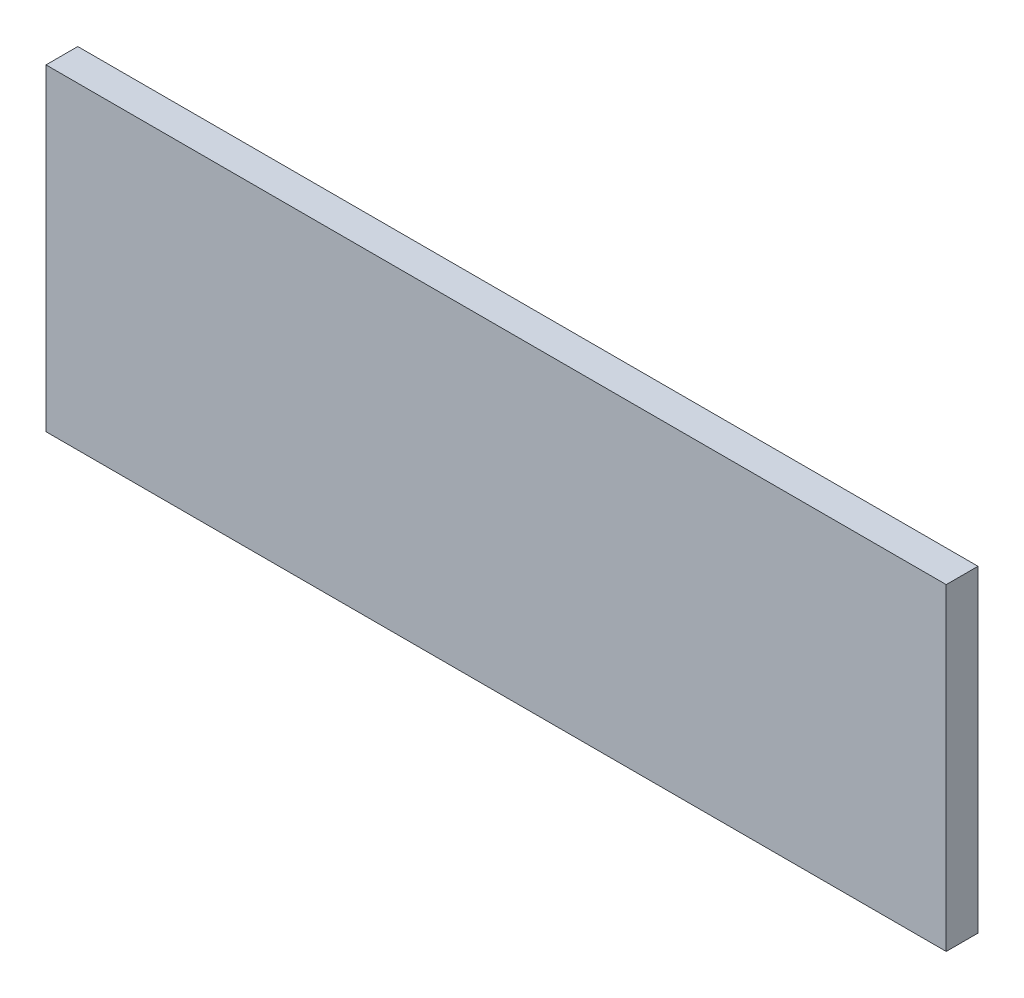
ISO-10303-21;
HEADER;
FILE_DESCRIPTION(('STEP AP214'),'2;1');
FILE_NAME('part.step','',(''),(''),'','','');
FILE_SCHEMA(('AUTOMOTIVE_DESIGN { 1 0 10303 214 1 1 1 1 }'));
ENDSEC;
DATA;
#1=APPLICATION_CONTEXT('core data for automotive mechanical design processes');
#2=APPLICATION_PROTOCOL_DEFINITION('international standard','automotive_design',2000,#1);
#3=PRODUCT_CONTEXT('',#1,'mechanical');
#4=PRODUCT('Part','Part','',(#3));
#5=PRODUCT_RELATED_PRODUCT_CATEGORY('part','',(#4));
#6=PRODUCT_DEFINITION_FORMATION('','',#4);
#7=PRODUCT_DEFINITION_CONTEXT('part definition',#1,'design');
#8=PRODUCT_DEFINITION('design','',#6,#7);
#9=PRODUCT_DEFINITION_SHAPE('','',#8);
#10=(LENGTH_UNIT() NAMED_UNIT(*) SI_UNIT(.MILLI.,.METRE.));
#11=(NAMED_UNIT(*) PLANE_ANGLE_UNIT() SI_UNIT($,.RADIAN.));
#12=(NAMED_UNIT(*) SI_UNIT($,.STERADIAN.) SOLID_ANGLE_UNIT());
#13=UNCERTAINTY_MEASURE_WITH_UNIT(LENGTH_MEASURE(1.E-05),#10,'distance_accuracy_value','');
#14=(GEOMETRIC_REPRESENTATION_CONTEXT(3) GLOBAL_UNCERTAINTY_ASSIGNED_CONTEXT((#13)) GLOBAL_UNIT_ASSIGNED_CONTEXT((#10,
#11,#12)) REPRESENTATION_CONTEXT('',''));
#15=CARTESIAN_POINT('',(0.,0.,0.));
#16=DIRECTION('',(0.,0.,1.));
#17=DIRECTION('',(1.,0.,0.));
#18=AXIS2_PLACEMENT_3D('',#15,#16,#17);
#19=CARTESIAN_POINT('',(0.,0.,6.));
#20=DIRECTION('',(1.,0.,0.));
#21=DIRECTION('',(0.,0.,-1.));
#22=AXIS2_PLACEMENT_3D('',#19,#20,#21);
#23=PLANE('',#22);
#24=DIRECTION('',(0.,-1.,0.));
#25=VECTOR('',#24,1.);
#26=CARTESIAN_POINT('',(0.,0.,0.));
#27=LINE('',#26,#25);
#28=CARTESIAN_POINT('',(0.,60.,0.));
#29=VERTEX_POINT('',#28);
#30=CARTESIAN_POINT('',(0.,0.,0.));
#31=VERTEX_POINT('',#30);
#32=EDGE_CURVE('E111',#29,#31,#27,.T.);
#33=ORIENTED_EDGE('',*,*,#32,.T.);
#34=DIRECTION('',(0.,0.,-1.));
#35=VECTOR('',#34,1.);
#36=CARTESIAN_POINT('',(0.,0.,6.));
#37=LINE('',#36,#35);
#38=CARTESIAN_POINT('',(0.,0.,6.));
#39=VERTEX_POINT('',#38);
#40=EDGE_CURVE('E11',#39,#31,#37,.T.);
#41=ORIENTED_EDGE('',*,*,#40,.F.);
#42=DIRECTION('',(0.,-1.,0.));
#43=VECTOR('',#42,1.);
#44=CARTESIAN_POINT('',(0.,0.,6.));
#45=LINE('',#44,#43);
#46=CARTESIAN_POINT('',(0.,60.,6.));
#47=VERTEX_POINT('',#46);
#48=EDGE_CURVE('E95',#47,#39,#45,.T.);
#49=ORIENTED_EDGE('',*,*,#48,.F.);
#50=DIRECTION('',(0.,0.,-1.));
#51=VECTOR('',#50,1.);
#52=CARTESIAN_POINT('',(0.,60.,6.));
#53=LINE('',#52,#51);
#54=EDGE_CURVE('E107',#47,#29,#53,.T.);
#55=ORIENTED_EDGE('',*,*,#54,.T.);
#56=EDGE_LOOP('',(#33,#41,#49,#55));
#57=FACE_BOUND('',#56,.T.);
#58=ADVANCED_FACE('F43',(#57),#23,.F.);
#59=CARTESIAN_POINT('',(0.,0.,6.));
#60=DIRECTION('',(0.,1.,0.));
#61=DIRECTION('',(0.,0.,1.));
#62=AXIS2_PLACEMENT_3D('',#59,#60,#61);
#63=PLANE('',#62);
#64=DIRECTION('',(1.,0.,0.));
#65=VECTOR('',#64,1.);
#66=CARTESIAN_POINT('',(0.,0.,0.));
#67=LINE('',#66,#65);
#68=CARTESIAN_POINT('',(170.,0.,0.));
#69=VERTEX_POINT('',#68);
#70=EDGE_CURVE('E100',#31,#69,#67,.T.);
#71=ORIENTED_EDGE('',*,*,#70,.T.);
#72=DIRECTION('',(0.,0.,-1.));
#73=VECTOR('',#72,1.);
#74=CARTESIAN_POINT('',(170.,0.,6.));
#75=LINE('',#74,#73);
#76=CARTESIAN_POINT('',(170.,0.,6.));
#77=VERTEX_POINT('',#76);
#78=EDGE_CURVE('E52',#77,#69,#75,.T.);
#79=ORIENTED_EDGE('',*,*,#78,.F.);
#80=DIRECTION('',(1.,0.,0.));
#81=VECTOR('',#80,1.);
#82=CARTESIAN_POINT('',(0.,0.,6.));
#83=LINE('',#82,#81);
#84=EDGE_CURVE('E90',#39,#77,#83,.T.);
#85=ORIENTED_EDGE('',*,*,#84,.F.);
#86=ORIENTED_EDGE('',*,*,#40,.T.);
#87=EDGE_LOOP('',(#71,#79,#85,#86));
#88=FACE_BOUND('',#87,.T.);
#89=ADVANCED_FACE('F99',(#88),#63,.F.);
#90=CARTESIAN_POINT('',(170.,0.,6.));
#91=DIRECTION('',(-1.,0.,0.));
#92=DIRECTION('',(0.,0.,1.));
#93=AXIS2_PLACEMENT_3D('',#90,#91,#92);
#94=PLANE('',#93);
#95=DIRECTION('',(0.,1.,0.));
#96=VECTOR('',#95,1.);
#97=CARTESIAN_POINT('',(170.,0.,0.));
#98=LINE('',#97,#96);
#99=CARTESIAN_POINT('',(170.,60.,0.));
#100=VERTEX_POINT('',#99);
#101=EDGE_CURVE('E77',#69,#100,#98,.T.);
#102=ORIENTED_EDGE('',*,*,#101,.T.);
#103=DIRECTION('',(0.,0.,-1.));
#104=VECTOR('',#103,1.);
#105=CARTESIAN_POINT('',(170.,60.,6.));
#106=LINE('',#105,#104);
#107=CARTESIAN_POINT('',(170.,60.,6.));
#108=VERTEX_POINT('',#107);
#109=EDGE_CURVE('E102',#108,#100,#106,.T.);
#110=ORIENTED_EDGE('',*,*,#109,.F.);
#111=DIRECTION('',(0.,1.,0.));
#112=VECTOR('',#111,1.);
#113=CARTESIAN_POINT('',(170.,0.,6.));
#114=LINE('',#113,#112);
#115=EDGE_CURVE('E93',#77,#108,#114,.T.);
#116=ORIENTED_EDGE('',*,*,#115,.F.);
#117=ORIENTED_EDGE('',*,*,#78,.T.);
#118=EDGE_LOOP('',(#102,#110,#116,#117));
#119=FACE_BOUND('',#118,.T.);
#120=ADVANCED_FACE('F103',(#119),#94,.F.);
#121=CARTESIAN_POINT('',(0.,60.,6.));
#122=DIRECTION('',(0.,-1.,0.));
#123=DIRECTION('',(0.,0.,-1.));
#124=AXIS2_PLACEMENT_3D('',#121,#122,#123);
#125=PLANE('',#124);
#126=DIRECTION('',(-1.,0.,0.));
#127=VECTOR('',#126,1.);
#128=CARTESIAN_POINT('',(0.,60.,0.));
#129=LINE('',#128,#127);
#130=EDGE_CURVE('E83',#100,#29,#129,.T.);
#131=ORIENTED_EDGE('',*,*,#130,.T.);
#132=ORIENTED_EDGE('',*,*,#54,.F.);
#133=DIRECTION('',(-1.,0.,0.));
#134=VECTOR('',#133,1.);
#135=CARTESIAN_POINT('',(0.,60.,6.));
#136=LINE('',#135,#134);
#137=EDGE_CURVE('E60',#108,#47,#136,.T.);
#138=ORIENTED_EDGE('',*,*,#137,.F.);
#139=ORIENTED_EDGE('',*,*,#109,.T.);
#140=EDGE_LOOP('',(#131,#132,#138,#139));
#141=FACE_BOUND('',#140,.T.);
#142=ADVANCED_FACE('F124',(#141),#125,.F.);
#143=CARTESIAN_POINT('',(0.,0.,6.));
#144=DIRECTION('',(0.,0.,-1.));
#145=DIRECTION('',(-1.,0.,0.));
#146=AXIS2_PLACEMENT_3D('',#143,#144,#145);
#147=PLANE('',#146);
#148=ORIENTED_EDGE('',*,*,#48,.T.);
#149=ORIENTED_EDGE('',*,*,#84,.T.);
#150=ORIENTED_EDGE('',*,*,#115,.T.);
#151=ORIENTED_EDGE('',*,*,#137,.T.);
#152=EDGE_LOOP('',(#148,#149,#150,#151));
#153=FACE_BOUND('',#152,.T.);
#154=ADVANCED_FACE('F91',(#153),#147,.F.);
#155=CARTESIAN_POINT('',(0.,0.,0.));
#156=DIRECTION('',(0.,0.,-1.));
#157=DIRECTION('',(-1.,0.,0.));
#158=AXIS2_PLACEMENT_3D('',#155,#156,#157);
#159=PLANE('',#158);
#160=ORIENTED_EDGE('',*,*,#32,.F.);
#161=ORIENTED_EDGE('',*,*,#130,.F.);
#162=ORIENTED_EDGE('',*,*,#101,.F.);
#163=ORIENTED_EDGE('',*,*,#70,.F.);
#164=EDGE_LOOP('',(#160,#161,#162,#163));
#165=FACE_BOUND('',#164,.T.);
#166=ADVANCED_FACE('F127',(#165),#159,.T.);
#167=CLOSED_SHELL('',(#58,#89,#120,#142,#154,#166));
#168=MANIFOLD_SOLID_BREP('B2',#167);
#169=ADVANCED_BREP_SHAPE_REPRESENTATION('',(#18,#168),#14);
#170=SHAPE_DEFINITION_REPRESENTATION(#9,#169);
ENDSEC;
END-ISO-10303-21;
